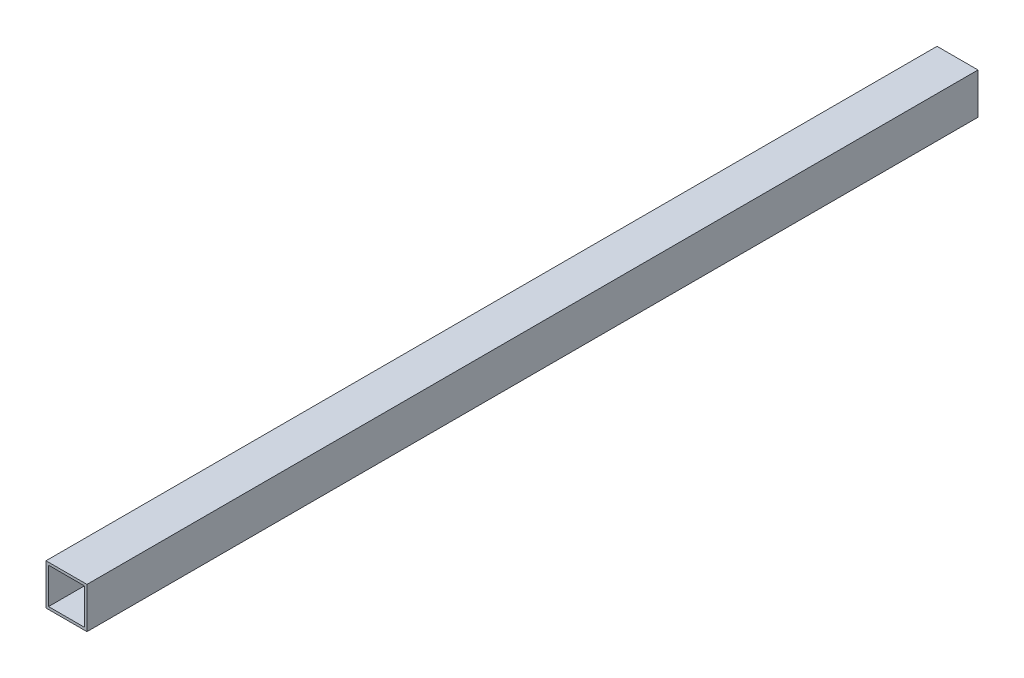
ISO-10303-21;
HEADER;
FILE_DESCRIPTION(('STEP AP214'),'2;1');
FILE_NAME('part.step','',(''),(''),'','','');
FILE_SCHEMA(('AUTOMOTIVE_DESIGN { 1 0 10303 214 1 1 1 1 }'));
ENDSEC;
DATA;
#1=APPLICATION_CONTEXT('core data for automotive mechanical design processes');
#2=APPLICATION_PROTOCOL_DEFINITION('international standard','automotive_design',2000,#1);
#3=PRODUCT_CONTEXT('',#1,'mechanical');
#4=PRODUCT('Part','Part','',(#3));
#5=PRODUCT_RELATED_PRODUCT_CATEGORY('part','',(#4));
#6=PRODUCT_DEFINITION_FORMATION('','',#4);
#7=PRODUCT_DEFINITION_CONTEXT('part definition',#1,'design');
#8=PRODUCT_DEFINITION('design','',#6,#7);
#9=PRODUCT_DEFINITION_SHAPE('','',#8);
#10=(LENGTH_UNIT() NAMED_UNIT(*) SI_UNIT(.MILLI.,.METRE.));
#11=(NAMED_UNIT(*) PLANE_ANGLE_UNIT() SI_UNIT($,.RADIAN.));
#12=(NAMED_UNIT(*) SI_UNIT($,.STERADIAN.) SOLID_ANGLE_UNIT());
#13=UNCERTAINTY_MEASURE_WITH_UNIT(LENGTH_MEASURE(1.E-05),#10,'distance_accuracy_value','');
#14=(GEOMETRIC_REPRESENTATION_CONTEXT(3) GLOBAL_UNCERTAINTY_ASSIGNED_CONTEXT((#13)) GLOBAL_UNIT_ASSIGNED_CONTEXT((#10,
#11,#12)) REPRESENTATION_CONTEXT('',''));
#15=CARTESIAN_POINT('',(0.,0.,0.));
#16=DIRECTION('',(0.,0.,1.));
#17=DIRECTION('',(1.,0.,0.));
#18=AXIS2_PLACEMENT_3D('',#15,#16,#17);
#19=CARTESIAN_POINT('',(25.4,25.4,-1104.9));
#20=DIRECTION('',(1.,0.,0.));
#21=DIRECTION('',(0.,0.,-1.));
#22=AXIS2_PLACEMENT_3D('',#19,#20,#21);
#23=PLANE('',#22);
#24=DIRECTION('',(0.,1.,0.));
#25=VECTOR('',#24,1.);
#26=CARTESIAN_POINT('',(25.4,25.4,0.));
#27=LINE('',#26,#25);
#28=CARTESIAN_POINT('',(25.4,-25.4,0.));
#29=VERTEX_POINT('',#28);
#30=CARTESIAN_POINT('',(25.4,25.4,0.));
#31=VERTEX_POINT('',#30);
#32=EDGE_CURVE('E148',#29,#31,#27,.T.);
#33=ORIENTED_EDGE('',*,*,#32,.F.);
#34=DIRECTION('',(0.,0.,1.));
#35=VECTOR('',#34,1.);
#36=CARTESIAN_POINT('',(25.4,-25.4,-1104.9));
#37=LINE('',#36,#35);
#38=CARTESIAN_POINT('',(25.4,-25.4,-1104.9));
#39=VERTEX_POINT('',#38);
#40=EDGE_CURVE('E11',#39,#29,#37,.T.);
#41=ORIENTED_EDGE('',*,*,#40,.F.);
#42=DIRECTION('',(0.,1.,0.));
#43=VECTOR('',#42,1.);
#44=CARTESIAN_POINT('',(25.4,25.4,-1104.9));
#45=LINE('',#44,#43);
#46=CARTESIAN_POINT('',(25.4,25.4,-1104.9));
#47=VERTEX_POINT('',#46);
#48=EDGE_CURVE('E154',#39,#47,#45,.T.);
#49=ORIENTED_EDGE('',*,*,#48,.T.);
#50=DIRECTION('',(0.,0.,1.));
#51=VECTOR('',#50,1.);
#52=CARTESIAN_POINT('',(25.4,25.4,-1104.9));
#53=LINE('',#52,#51);
#54=EDGE_CURVE('E42',#47,#31,#53,.T.);
#55=ORIENTED_EDGE('',*,*,#54,.T.);
#56=EDGE_LOOP('',(#33,#41,#49,#55));
#57=FACE_BOUND('',#56,.T.);
#58=ADVANCED_FACE('F39',(#57),#23,.T.);
#59=CARTESIAN_POINT('',(-25.4,-25.4,-1104.9));
#60=DIRECTION('',(0.,-1.,0.));
#61=DIRECTION('',(0.,0.,-1.));
#62=AXIS2_PLACEMENT_3D('',#59,#60,#61);
#63=PLANE('',#62);
#64=DIRECTION('',(1.,0.,0.));
#65=VECTOR('',#64,1.);
#66=CARTESIAN_POINT('',(-25.4,-25.4,0.));
#67=LINE('',#66,#65);
#68=CARTESIAN_POINT('',(-25.4,-25.4,0.));
#69=VERTEX_POINT('',#68);
#70=EDGE_CURVE('E159',#69,#29,#67,.T.);
#71=ORIENTED_EDGE('',*,*,#70,.F.);
#72=DIRECTION('',(0.,0.,1.));
#73=VECTOR('',#72,1.);
#74=CARTESIAN_POINT('',(-25.4,-25.4,-1104.9));
#75=LINE('',#74,#73);
#76=CARTESIAN_POINT('',(-25.4,-25.4,-1104.9));
#77=VERTEX_POINT('',#76);
#78=EDGE_CURVE('E48',#77,#69,#75,.T.);
#79=ORIENTED_EDGE('',*,*,#78,.F.);
#80=DIRECTION('',(1.,0.,0.));
#81=VECTOR('',#80,1.);
#82=CARTESIAN_POINT('',(-25.4,-25.4,-1104.9));
#83=LINE('',#82,#81);
#84=EDGE_CURVE('E167',#77,#39,#83,.T.);
#85=ORIENTED_EDGE('',*,*,#84,.T.);
#86=ORIENTED_EDGE('',*,*,#40,.T.);
#87=EDGE_LOOP('',(#71,#79,#85,#86));
#88=FACE_BOUND('',#87,.T.);
#89=ADVANCED_FACE('F201',(#88),#63,.T.);
#90=CARTESIAN_POINT('',(-25.4,25.4,-1104.9));
#91=DIRECTION('',(-1.,0.,0.));
#92=DIRECTION('',(0.,0.,1.));
#93=AXIS2_PLACEMENT_3D('',#90,#91,#92);
#94=PLANE('',#93);
#95=DIRECTION('',(0.,-1.,0.));
#96=VECTOR('',#95,1.);
#97=CARTESIAN_POINT('',(-25.4,25.4,0.));
#98=LINE('',#97,#96);
#99=CARTESIAN_POINT('',(-25.4,25.4,0.));
#100=VERTEX_POINT('',#99);
#101=EDGE_CURVE('E178',#100,#69,#98,.T.);
#102=ORIENTED_EDGE('',*,*,#101,.F.);
#103=DIRECTION('',(0.,0.,1.));
#104=VECTOR('',#103,1.);
#105=CARTESIAN_POINT('',(-25.4,25.4,-1104.9));
#106=LINE('',#105,#104);
#107=CARTESIAN_POINT('',(-25.4,25.4,-1104.9));
#108=VERTEX_POINT('',#107);
#109=EDGE_CURVE('E186',#108,#100,#106,.T.);
#110=ORIENTED_EDGE('',*,*,#109,.F.);
#111=DIRECTION('',(0.,-1.,0.));
#112=VECTOR('',#111,1.);
#113=CARTESIAN_POINT('',(-25.4,25.4,-1104.9));
#114=LINE('',#113,#112);
#115=EDGE_CURVE('E163',#108,#77,#114,.T.);
#116=ORIENTED_EDGE('',*,*,#115,.T.);
#117=ORIENTED_EDGE('',*,*,#78,.T.);
#118=EDGE_LOOP('',(#102,#110,#116,#117));
#119=FACE_BOUND('',#118,.T.);
#120=ADVANCED_FACE('F205',(#119),#94,.T.);
#121=CARTESIAN_POINT('',(-25.4,25.4,-1104.9));
#122=DIRECTION('',(0.,1.,0.));
#123=DIRECTION('',(0.,0.,1.));
#124=AXIS2_PLACEMENT_3D('',#121,#122,#123);
#125=PLANE('',#124);
#126=DIRECTION('',(-1.,0.,0.));
#127=VECTOR('',#126,1.);
#128=CARTESIAN_POINT('',(-25.4,25.4,0.));
#129=LINE('',#128,#127);
#130=EDGE_CURVE('E174',#31,#100,#129,.T.);
#131=ORIENTED_EDGE('',*,*,#130,.F.);
#132=ORIENTED_EDGE('',*,*,#54,.F.);
#133=DIRECTION('',(-1.,0.,0.));
#134=VECTOR('',#133,1.);
#135=CARTESIAN_POINT('',(-25.4,25.4,-1104.9));
#136=LINE('',#135,#134);
#137=EDGE_CURVE('E158',#47,#108,#136,.T.);
#138=ORIENTED_EDGE('',*,*,#137,.T.);
#139=ORIENTED_EDGE('',*,*,#109,.T.);
#140=EDGE_LOOP('',(#131,#132,#138,#139));
#141=FACE_BOUND('',#140,.T.);
#142=ADVANCED_FACE('F196',(#141),#125,.T.);
#143=CARTESIAN_POINT('',(0.,0.,-1104.9));
#144=DIRECTION('',(0.,0.,1.));
#145=DIRECTION('',(1.,0.,0.));
#146=AXIS2_PLACEMENT_3D('',#143,#144,#145);
#147=PLANE('',#146);
#148=DIRECTION('',(1.,0.,0.));
#149=VECTOR('',#148,1.);
#150=CARTESIAN_POINT('',(-22.225,-22.225,-1104.9));
#151=LINE('',#150,#149);
#152=CARTESIAN_POINT('',(-22.225,-22.225,-1104.9));
#153=VERTEX_POINT('',#152);
#154=CARTESIAN_POINT('',(22.225,-22.225,-1104.9));
#155=VERTEX_POINT('',#154);
#156=EDGE_CURVE('E114',#153,#155,#151,.T.);
#157=ORIENTED_EDGE('',*,*,#156,.T.);
#158=DIRECTION('',(0.,1.,0.));
#159=VECTOR('',#158,1.);
#160=CARTESIAN_POINT('',(22.225,22.225,-1104.9));
#161=LINE('',#160,#159);
#162=CARTESIAN_POINT('',(22.225,22.225,-1104.9));
#163=VERTEX_POINT('',#162);
#164=EDGE_CURVE('E107',#155,#163,#161,.T.);
#165=ORIENTED_EDGE('',*,*,#164,.T.);
#166=DIRECTION('',(-1.,0.,0.));
#167=VECTOR('',#166,1.);
#168=CARTESIAN_POINT('',(-22.225,22.225,-1104.9));
#169=LINE('',#168,#167);
#170=CARTESIAN_POINT('',(-22.225,22.225,-1104.9));
#171=VERTEX_POINT('',#170);
#172=EDGE_CURVE('E117',#163,#171,#169,.T.);
#173=ORIENTED_EDGE('',*,*,#172,.T.);
#174=DIRECTION('',(0.,-1.,0.));
#175=VECTOR('',#174,1.);
#176=CARTESIAN_POINT('',(-22.225,22.225,-1104.9));
#177=LINE('',#176,#175);
#178=EDGE_CURVE('E56',#171,#153,#177,.T.);
#179=ORIENTED_EDGE('',*,*,#178,.T.);
#180=EDGE_LOOP('',(#157,#165,#173,#179));
#181=FACE_BOUND('',#180,.T.);
#182=ORIENTED_EDGE('',*,*,#48,.F.);
#183=ORIENTED_EDGE('',*,*,#84,.F.);
#184=ORIENTED_EDGE('',*,*,#115,.F.);
#185=ORIENTED_EDGE('',*,*,#137,.F.);
#186=EDGE_LOOP('',(#182,#183,#184,#185));
#187=FACE_BOUND('',#186,.T.);
#188=ADVANCED_FACE('F122',(#181,#187),#147,.F.);
#189=CARTESIAN_POINT('',(0.,0.,0.));
#190=DIRECTION('',(0.,0.,1.));
#191=DIRECTION('',(1.,0.,0.));
#192=AXIS2_PLACEMENT_3D('',#189,#190,#191);
#193=PLANE('',#192);
#194=DIRECTION('',(0.,1.,0.));
#195=VECTOR('',#194,1.);
#196=CARTESIAN_POINT('',(22.225,22.225,0.));
#197=LINE('',#196,#195);
#198=CARTESIAN_POINT('',(22.225,-22.225,0.));
#199=VERTEX_POINT('',#198);
#200=CARTESIAN_POINT('',(22.225,22.225,0.));
#201=VERTEX_POINT('',#200);
#202=EDGE_CURVE('E64',#199,#201,#197,.T.);
#203=ORIENTED_EDGE('',*,*,#202,.F.);
#204=DIRECTION('',(1.,0.,0.));
#205=VECTOR('',#204,1.);
#206=CARTESIAN_POINT('',(-22.225,-22.225,0.));
#207=LINE('',#206,#205);
#208=CARTESIAN_POINT('',(-22.225,-22.225,0.));
#209=VERTEX_POINT('',#208);
#210=EDGE_CURVE('E126',#209,#199,#207,.T.);
#211=ORIENTED_EDGE('',*,*,#210,.F.);
#212=DIRECTION('',(0.,-1.,0.));
#213=VECTOR('',#212,1.);
#214=CARTESIAN_POINT('',(-22.225,22.225,0.));
#215=LINE('',#214,#213);
#216=CARTESIAN_POINT('',(-22.225,22.225,0.));
#217=VERTEX_POINT('',#216);
#218=EDGE_CURVE('E130',#217,#209,#215,.T.);
#219=ORIENTED_EDGE('',*,*,#218,.F.);
#220=DIRECTION('',(-1.,0.,0.));
#221=VECTOR('',#220,1.);
#222=CARTESIAN_POINT('',(-22.225,22.225,0.));
#223=LINE('',#222,#221);
#224=EDGE_CURVE('E139',#201,#217,#223,.T.);
#225=ORIENTED_EDGE('',*,*,#224,.F.);
#226=EDGE_LOOP('',(#203,#211,#219,#225));
#227=FACE_BOUND('',#226,.T.);
#228=ORIENTED_EDGE('',*,*,#32,.T.);
#229=ORIENTED_EDGE('',*,*,#130,.T.);
#230=ORIENTED_EDGE('',*,*,#101,.T.);
#231=ORIENTED_EDGE('',*,*,#70,.T.);
#232=EDGE_LOOP('',(#228,#229,#230,#231));
#233=FACE_BOUND('',#232,.T.);
#234=ADVANCED_FACE('F198',(#227,#233),#193,.T.);
#235=CARTESIAN_POINT('',(22.225,22.225,-1104.9));
#236=DIRECTION('',(1.,0.,0.));
#237=DIRECTION('',(0.,0.,-1.));
#238=AXIS2_PLACEMENT_3D('',#235,#236,#237);
#239=PLANE('',#238);
#240=ORIENTED_EDGE('',*,*,#202,.T.);
#241=DIRECTION('',(0.,0.,1.));
#242=VECTOR('',#241,1.);
#243=CARTESIAN_POINT('',(22.225,22.225,-1104.9));
#244=LINE('',#243,#242);
#245=EDGE_CURVE('E103',#163,#201,#244,.T.);
#246=ORIENTED_EDGE('',*,*,#245,.F.);
#247=ORIENTED_EDGE('',*,*,#164,.F.);
#248=DIRECTION('',(0.,0.,1.));
#249=VECTOR('',#248,1.);
#250=CARTESIAN_POINT('',(22.225,-22.225,-1104.9));
#251=LINE('',#250,#249);
#252=EDGE_CURVE('E145',#155,#199,#251,.T.);
#253=ORIENTED_EDGE('',*,*,#252,.T.);
#254=EDGE_LOOP('',(#240,#246,#247,#253));
#255=FACE_BOUND('',#254,.T.);
#256=ADVANCED_FACE('F105',(#255),#239,.F.);
#257=CARTESIAN_POINT('',(-22.225,-22.225,-1104.9));
#258=DIRECTION('',(0.,-1.,0.));
#259=DIRECTION('',(0.,0.,-1.));
#260=AXIS2_PLACEMENT_3D('',#257,#258,#259);
#261=PLANE('',#260);
#262=ORIENTED_EDGE('',*,*,#210,.T.);
#263=ORIENTED_EDGE('',*,*,#252,.F.);
#264=ORIENTED_EDGE('',*,*,#156,.F.);
#265=DIRECTION('',(0.,0.,1.));
#266=VECTOR('',#265,1.);
#267=CARTESIAN_POINT('',(-22.225,-22.225,-1104.9));
#268=LINE('',#267,#266);
#269=EDGE_CURVE('E149',#153,#209,#268,.T.);
#270=ORIENTED_EDGE('',*,*,#269,.T.);
#271=EDGE_LOOP('',(#262,#263,#264,#270));
#272=FACE_BOUND('',#271,.T.);
#273=ADVANCED_FACE('F256',(#272),#261,.F.);
#274=CARTESIAN_POINT('',(-22.225,22.225,-1104.9));
#275=DIRECTION('',(-1.,0.,0.));
#276=DIRECTION('',(0.,0.,1.));
#277=AXIS2_PLACEMENT_3D('',#274,#275,#276);
#278=PLANE('',#277);
#279=ORIENTED_EDGE('',*,*,#218,.T.);
#280=ORIENTED_EDGE('',*,*,#269,.F.);
#281=ORIENTED_EDGE('',*,*,#178,.F.);
#282=DIRECTION('',(0.,0.,1.));
#283=VECTOR('',#282,1.);
#284=CARTESIAN_POINT('',(-22.225,22.225,-1104.9));
#285=LINE('',#284,#283);
#286=EDGE_CURVE('E113',#171,#217,#285,.T.);
#287=ORIENTED_EDGE('',*,*,#286,.T.);
#288=EDGE_LOOP('',(#279,#280,#281,#287));
#289=FACE_BOUND('',#288,.T.);
#290=ADVANCED_FACE('F265',(#289),#278,.F.);
#291=CARTESIAN_POINT('',(-22.225,22.225,-1104.9));
#292=DIRECTION('',(0.,1.,0.));
#293=DIRECTION('',(0.,0.,1.));
#294=AXIS2_PLACEMENT_3D('',#291,#292,#293);
#295=PLANE('',#294);
#296=ORIENTED_EDGE('',*,*,#224,.T.);
#297=ORIENTED_EDGE('',*,*,#286,.F.);
#298=ORIENTED_EDGE('',*,*,#172,.F.);
#299=ORIENTED_EDGE('',*,*,#245,.T.);
#300=EDGE_LOOP('',(#296,#297,#298,#299));
#301=FACE_BOUND('',#300,.T.);
#302=ADVANCED_FACE('F118',(#301),#295,.F.);
#303=CLOSED_SHELL('',(#58,#89,#120,#142,#188,#234,#256,#273,#290,#302));
#304=MANIFOLD_SOLID_BREP('B2',#303);
#305=ADVANCED_BREP_SHAPE_REPRESENTATION('',(#18,#304),#14);
#306=SHAPE_DEFINITION_REPRESENTATION(#9,#305);
ENDSEC;
END-ISO-10303-21;
